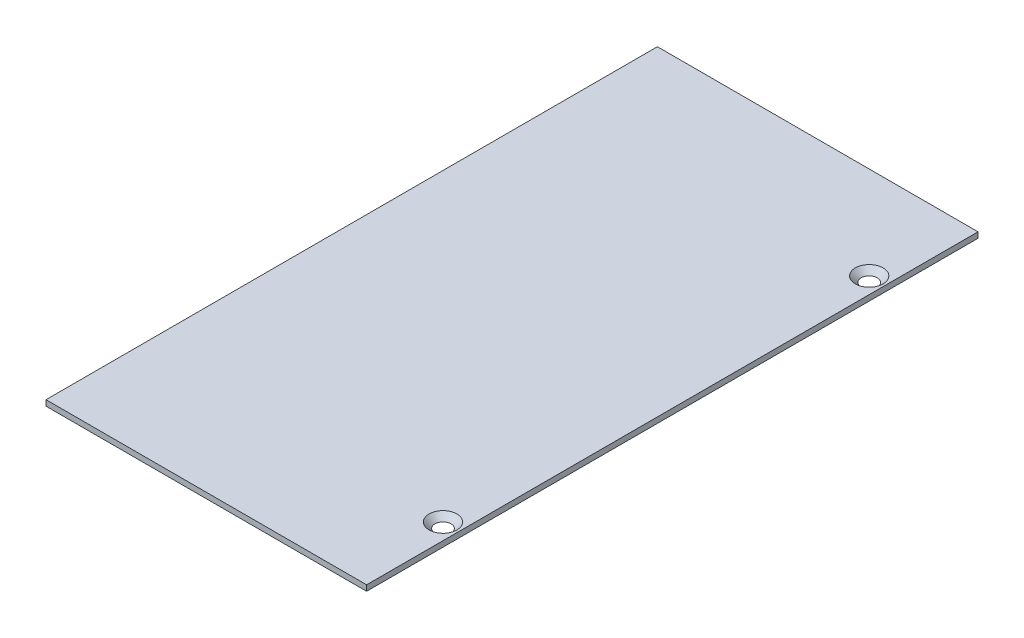
ISO-10303-21;
HEADER;
FILE_DESCRIPTION(('STEP AP214'),'2;1');
FILE_NAME('part.step','',(''),(''),'','','');
FILE_SCHEMA(('AUTOMOTIVE_DESIGN { 1 0 10303 214 1 1 1 1 }'));
ENDSEC;
DATA;
#1=APPLICATION_CONTEXT('core data for automotive mechanical design processes');
#2=APPLICATION_PROTOCOL_DEFINITION('international standard','automotive_design',2000,#1);
#3=PRODUCT_CONTEXT('',#1,'mechanical');
#4=PRODUCT('Part','Part','',(#3));
#5=PRODUCT_RELATED_PRODUCT_CATEGORY('part','',(#4));
#6=PRODUCT_DEFINITION_FORMATION('','',#4);
#7=PRODUCT_DEFINITION_CONTEXT('part definition',#1,'design');
#8=PRODUCT_DEFINITION('design','',#6,#7);
#9=PRODUCT_DEFINITION_SHAPE('','',#8);
#10=(LENGTH_UNIT() NAMED_UNIT(*) SI_UNIT(.MILLI.,.METRE.));
#11=(NAMED_UNIT(*) PLANE_ANGLE_UNIT() SI_UNIT($,.RADIAN.));
#12=(NAMED_UNIT(*) SI_UNIT($,.STERADIAN.) SOLID_ANGLE_UNIT());
#13=UNCERTAINTY_MEASURE_WITH_UNIT(LENGTH_MEASURE(1.E-05),#10,'distance_accuracy_value','');
#14=(GEOMETRIC_REPRESENTATION_CONTEXT(3) GLOBAL_UNCERTAINTY_ASSIGNED_CONTEXT((#13)) GLOBAL_UNIT_ASSIGNED_CONTEXT((#10,
#11,#12)) REPRESENTATION_CONTEXT('',''));
#15=CARTESIAN_POINT('',(0.,0.,0.));
#16=DIRECTION('',(0.,0.,1.));
#17=DIRECTION('',(1.,0.,0.));
#18=AXIS2_PLACEMENT_3D('',#15,#16,#17);
#19=CARTESIAN_POINT('',(0.,1.2192,0.));
#20=DIRECTION('',(1.,0.,0.));
#21=DIRECTION('',(0.,0.,-1.));
#22=AXIS2_PLACEMENT_3D('',#19,#20,#21);
#23=PLANE('',#22);
#24=DIRECTION('',(0.,0.,1.));
#25=VECTOR('',#24,1.);
#26=CARTESIAN_POINT('',(0.,0.,0.));
#27=LINE('',#26,#25);
#28=CARTESIAN_POINT('',(0.,0.,-132.04));
#29=VERTEX_POINT('',#28);
#30=CARTESIAN_POINT('',(0.,0.,0.));
#31=VERTEX_POINT('',#30);
#32=EDGE_CURVE('E103',#29,#31,#27,.T.);
#33=ORIENTED_EDGE('',*,*,#32,.T.);
#34=DIRECTION('',(0.,-1.,0.));
#35=VECTOR('',#34,1.);
#36=CARTESIAN_POINT('',(0.,1.2192,0.));
#37=LINE('',#36,#35);
#38=CARTESIAN_POINT('',(0.,1.2192,0.));
#39=VERTEX_POINT('',#38);
#40=EDGE_CURVE('E11',#39,#31,#37,.T.);
#41=ORIENTED_EDGE('',*,*,#40,.F.);
#42=DIRECTION('',(0.,0.,1.));
#43=VECTOR('',#42,1.);
#44=CARTESIAN_POINT('',(0.,1.2192,0.));
#45=LINE('',#44,#43);
#46=CARTESIAN_POINT('',(0.,1.2192,-132.04));
#47=VERTEX_POINT('',#46);
#48=EDGE_CURVE('E90',#47,#39,#45,.T.);
#49=ORIENTED_EDGE('',*,*,#48,.F.);
#50=DIRECTION('',(0.,-1.,0.));
#51=VECTOR('',#50,1.);
#52=CARTESIAN_POINT('',(0.,1.2192,-132.04));
#53=LINE('',#52,#51);
#54=EDGE_CURVE('E99',#47,#29,#53,.T.);
#55=ORIENTED_EDGE('',*,*,#54,.T.);
#56=EDGE_LOOP('',(#33,#41,#49,#55));
#57=FACE_BOUND('',#56,.T.);
#58=ADVANCED_FACE('F38',(#57),#23,.F.);
#59=CARTESIAN_POINT('',(0.,1.2192,0.));
#60=DIRECTION('',(0.,0.,-1.));
#61=DIRECTION('',(-1.,0.,0.));
#62=AXIS2_PLACEMENT_3D('',#59,#60,#61);
#63=PLANE('',#62);
#64=DIRECTION('',(1.,0.,0.));
#65=VECTOR('',#64,1.);
#66=CARTESIAN_POINT('',(0.,0.,0.));
#67=LINE('',#66,#65);
#68=CARTESIAN_POINT('',(69.24,0.,0.));
#69=VERTEX_POINT('',#68);
#70=EDGE_CURVE('E94',#31,#69,#67,.T.);
#71=ORIENTED_EDGE('',*,*,#70,.T.);
#72=DIRECTION('',(0.,-1.,0.));
#73=VECTOR('',#72,1.);
#74=CARTESIAN_POINT('',(69.24,1.2192,0.));
#75=LINE('',#74,#73);
#76=CARTESIAN_POINT('',(69.24,1.2192,0.));
#77=VERTEX_POINT('',#76);
#78=EDGE_CURVE('E47',#77,#69,#75,.T.);
#79=ORIENTED_EDGE('',*,*,#78,.F.);
#80=DIRECTION('',(1.,0.,0.));
#81=VECTOR('',#80,1.);
#82=CARTESIAN_POINT('',(0.,1.2192,0.));
#83=LINE('',#82,#81);
#84=EDGE_CURVE('E85',#39,#77,#83,.T.);
#85=ORIENTED_EDGE('',*,*,#84,.F.);
#86=ORIENTED_EDGE('',*,*,#40,.T.);
#87=EDGE_LOOP('',(#71,#79,#85,#86));
#88=FACE_BOUND('',#87,.T.);
#89=ADVANCED_FACE('F93',(#88),#63,.F.);
#90=CARTESIAN_POINT('',(69.24,1.2192,0.));
#91=DIRECTION('',(-1.,0.,0.));
#92=DIRECTION('',(0.,0.,1.));
#93=AXIS2_PLACEMENT_3D('',#90,#91,#92);
#94=PLANE('',#93);
#95=DIRECTION('',(0.,0.,-1.));
#96=VECTOR('',#95,1.);
#97=CARTESIAN_POINT('',(69.24,0.,0.));
#98=LINE('',#97,#96);
#99=CARTESIAN_POINT('',(69.24,0.,-132.04));
#100=VERTEX_POINT('',#99);
#101=EDGE_CURVE('E72',#69,#100,#98,.T.);
#102=ORIENTED_EDGE('',*,*,#101,.T.);
#103=DIRECTION('',(0.,-1.,0.));
#104=VECTOR('',#103,1.);
#105=CARTESIAN_POINT('',(69.24,1.2192,-132.04));
#106=LINE('',#105,#104);
#107=CARTESIAN_POINT('',(69.24,1.2192,-132.04));
#108=VERTEX_POINT('',#107);
#109=EDGE_CURVE('E95',#108,#100,#106,.T.);
#110=ORIENTED_EDGE('',*,*,#109,.F.);
#111=DIRECTION('',(0.,0.,-1.));
#112=VECTOR('',#111,1.);
#113=CARTESIAN_POINT('',(69.24,1.2192,0.));
#114=LINE('',#113,#112);
#115=EDGE_CURVE('E88',#77,#108,#114,.T.);
#116=ORIENTED_EDGE('',*,*,#115,.F.);
#117=ORIENTED_EDGE('',*,*,#78,.T.);
#118=EDGE_LOOP('',(#102,#110,#116,#117));
#119=FACE_BOUND('',#118,.T.);
#120=ADVANCED_FACE('F97',(#119),#94,.F.);
#121=CARTESIAN_POINT('',(0.,1.2192,-132.04));
#122=DIRECTION('',(0.,0.,1.));
#123=DIRECTION('',(1.,0.,0.));
#124=AXIS2_PLACEMENT_3D('',#121,#122,#123);
#125=PLANE('',#124);
#126=DIRECTION('',(-1.,0.,0.));
#127=VECTOR('',#126,1.);
#128=CARTESIAN_POINT('',(0.,0.,-132.04));
#129=LINE('',#128,#127);
#130=EDGE_CURVE('E78',#100,#29,#129,.T.);
#131=ORIENTED_EDGE('',*,*,#130,.T.);
#132=ORIENTED_EDGE('',*,*,#54,.F.);
#133=DIRECTION('',(-1.,0.,0.));
#134=VECTOR('',#133,1.);
#135=CARTESIAN_POINT('',(0.,1.2192,-132.04));
#136=LINE('',#135,#134);
#137=EDGE_CURVE('E55',#108,#47,#136,.T.);
#138=ORIENTED_EDGE('',*,*,#137,.F.);
#139=ORIENTED_EDGE('',*,*,#109,.T.);
#140=EDGE_LOOP('',(#131,#132,#138,#139));
#141=FACE_BOUND('',#140,.T.);
#142=ADVANCED_FACE('F111',(#141),#125,.F.);
#143=CARTESIAN_POINT('',(0.,1.2192,0.));
#144=DIRECTION('',(0.,-1.,0.));
#145=DIRECTION('',(0.,0.,-1.));
#146=AXIS2_PLACEMENT_3D('',#143,#144,#145);
#147=PLANE('',#146);
#148=CARTESIAN_POINT('',(65.74,1.2192,-112.04));
#149=DIRECTION('',(0.,1.,0.));
#150=DIRECTION('',(0.,0.,1.));
#151=AXIS2_PLACEMENT_3D('',#148,#149,#150);
#152=CIRCLE('',#151,3.);
#153=CARTESIAN_POINT('',(65.74,1.2192,-109.04));
#154=VERTEX_POINT('',#153);
#155=EDGE_CURVE('E122',#154,#154,#152,.T.);
#156=ORIENTED_EDGE('',*,*,#155,.F.);
#157=EDGE_LOOP('',(#156));
#158=FACE_BOUND('',#157,.T.);
#159=CARTESIAN_POINT('',(65.74,1.2192,-20.));
#160=DIRECTION('',(0.,1.,0.));
#161=DIRECTION('',(0.,0.,1.));
#162=AXIS2_PLACEMENT_3D('',#159,#160,#161);
#163=CIRCLE('',#162,3.);
#164=CARTESIAN_POINT('',(65.74,1.2192,-17.));
#165=VERTEX_POINT('',#164);
#166=EDGE_CURVE('E119',#165,#165,#163,.T.);
#167=ORIENTED_EDGE('',*,*,#166,.F.);
#168=EDGE_LOOP('',(#167));
#169=FACE_BOUND('',#168,.T.);
#170=ORIENTED_EDGE('',*,*,#48,.T.);
#171=ORIENTED_EDGE('',*,*,#84,.T.);
#172=ORIENTED_EDGE('',*,*,#115,.T.);
#173=ORIENTED_EDGE('',*,*,#137,.T.);
#174=EDGE_LOOP('',(#170,#171,#172,#173));
#175=FACE_BOUND('',#174,.T.);
#176=ADVANCED_FACE('F86',(#158,#169,#175),#147,.F.);
#177=CARTESIAN_POINT('',(0.,0.,0.));
#178=DIRECTION('',(0.,-1.,0.));
#179=DIRECTION('',(0.,0.,-1.));
#180=AXIS2_PLACEMENT_3D('',#177,#178,#179);
#181=PLANE('',#180);
#182=CARTESIAN_POINT('',(65.74,0.,-112.04));
#183=DIRECTION('',(0.,-1.,0.));
#184=DIRECTION('',(0.,0.,-1.));
#185=AXIS2_PLACEMENT_3D('',#182,#183,#184);
#186=CIRCLE('',#185,1.73748144142653);
#187=CARTESIAN_POINT('',(65.74,0.,-113.777481441427));
#188=VERTEX_POINT('',#187);
#189=EDGE_CURVE('E41',#188,#188,#186,.T.);
#190=ORIENTED_EDGE('',*,*,#189,.F.);
#191=EDGE_LOOP('',(#190));
#192=FACE_BOUND('',#191,.T.);
#193=CARTESIAN_POINT('',(65.74,0.,-20.));
#194=DIRECTION('',(0.,-1.,0.));
#195=DIRECTION('',(0.,0.,-1.));
#196=AXIS2_PLACEMENT_3D('',#193,#194,#195);
#197=CIRCLE('',#196,1.73748144142653);
#198=CARTESIAN_POINT('',(65.74,0.,-21.7374814414265));
#199=VERTEX_POINT('',#198);
#200=EDGE_CURVE('E106',#199,#199,#197,.T.);
#201=ORIENTED_EDGE('',*,*,#200,.F.);
#202=EDGE_LOOP('',(#201));
#203=FACE_BOUND('',#202,.T.);
#204=ORIENTED_EDGE('',*,*,#32,.F.);
#205=ORIENTED_EDGE('',*,*,#130,.F.);
#206=ORIENTED_EDGE('',*,*,#101,.F.);
#207=ORIENTED_EDGE('',*,*,#70,.F.);
#208=EDGE_LOOP('',(#204,#205,#206,#207));
#209=FACE_BOUND('',#208,.T.);
#210=ADVANCED_FACE('F114',(#192,#203,#209),#181,.T.);
#211=CARTESIAN_POINT('',(65.74,1.2192,-20.));
#212=DIRECTION('',(0.,1.,0.));
#213=DIRECTION('',(0.,0.,1.));
#214=AXIS2_PLACEMENT_3D('',#211,#212,#213);
#215=CONICAL_SURFACE('',#214,3.,0.802851455917393);
#216=ORIENTED_EDGE('',*,*,#200,.T.);
#217=EDGE_LOOP('',(#216));
#218=FACE_BOUND('',#217,.T.);
#219=ORIENTED_EDGE('',*,*,#166,.T.);
#220=EDGE_LOOP('',(#219));
#221=FACE_BOUND('',#220,.T.);
#222=ADVANCED_FACE('F133',(#218,#221),#215,.F.);
#223=CARTESIAN_POINT('',(65.74,1.2192,-112.04));
#224=DIRECTION('',(0.,1.,0.));
#225=DIRECTION('',(0.,0.,1.));
#226=AXIS2_PLACEMENT_3D('',#223,#224,#225);
#227=CONICAL_SURFACE('',#226,3.,0.802851455917393);
#228=ORIENTED_EDGE('',*,*,#189,.T.);
#229=EDGE_LOOP('',(#228));
#230=FACE_BOUND('',#229,.T.);
#231=ORIENTED_EDGE('',*,*,#155,.T.);
#232=EDGE_LOOP('',(#231));
#233=FACE_BOUND('',#232,.T.);
#234=ADVANCED_FACE('F129',(#230,#233),#227,.F.);
#235=CLOSED_SHELL('',(#58,#89,#120,#142,#176,#210,#222,#234));
#236=MANIFOLD_SOLID_BREP('B2',#235);
#237=ADVANCED_BREP_SHAPE_REPRESENTATION('',(#18,#236),#14);
#238=SHAPE_DEFINITION_REPRESENTATION(#9,#237);
ENDSEC;
END-ISO-10303-21;
